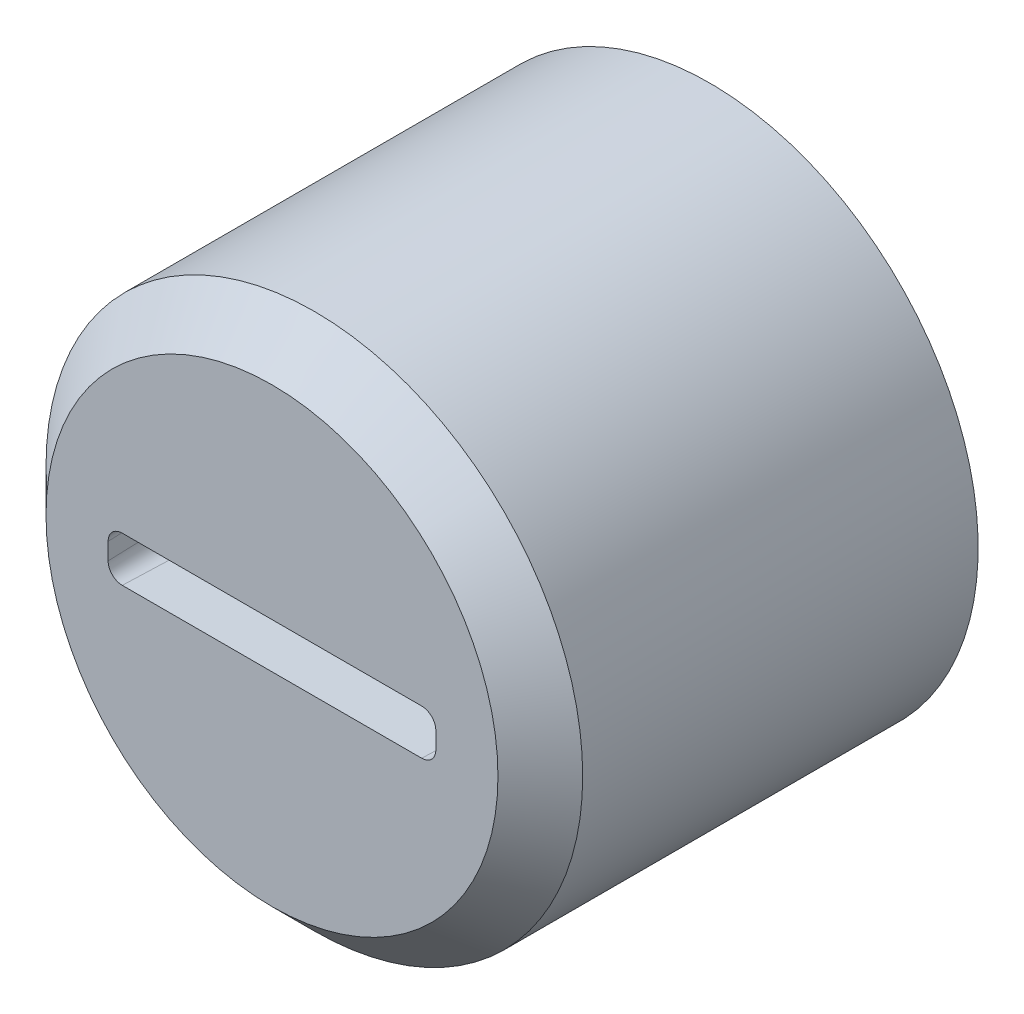
ISO-10303-21;
HEADER;
FILE_DESCRIPTION(('STEP AP214'),'2;1');
FILE_NAME('part.step','',(''),(''),'','','');
FILE_SCHEMA(('AUTOMOTIVE_DESIGN { 1 0 10303 214 1 1 1 1 }'));
ENDSEC;
DATA;
#1=APPLICATION_CONTEXT('core data for automotive mechanical design processes');
#2=APPLICATION_PROTOCOL_DEFINITION('international standard','automotive_design',2000,#1);
#3=PRODUCT_CONTEXT('',#1,'mechanical');
#4=PRODUCT('Part','Part','',(#3));
#5=PRODUCT_RELATED_PRODUCT_CATEGORY('part','',(#4));
#6=PRODUCT_DEFINITION_FORMATION('','',#4);
#7=PRODUCT_DEFINITION_CONTEXT('part definition',#1,'design');
#8=PRODUCT_DEFINITION('design','',#6,#7);
#9=PRODUCT_DEFINITION_SHAPE('','',#8);
#10=(LENGTH_UNIT() NAMED_UNIT(*) SI_UNIT(.MILLI.,.METRE.));
#11=(NAMED_UNIT(*) PLANE_ANGLE_UNIT() SI_UNIT($,.RADIAN.));
#12=(NAMED_UNIT(*) SI_UNIT($,.STERADIAN.) SOLID_ANGLE_UNIT());
#13=UNCERTAINTY_MEASURE_WITH_UNIT(LENGTH_MEASURE(1.E-05),#10,'distance_accuracy_value','');
#14=(GEOMETRIC_REPRESENTATION_CONTEXT(3) GLOBAL_UNCERTAINTY_ASSIGNED_CONTEXT((#13)) GLOBAL_UNIT_ASSIGNED_CONTEXT((#10,
#11,#12)) REPRESENTATION_CONTEXT('',''));
#15=CARTESIAN_POINT('',(0.,0.,0.));
#16=DIRECTION('',(0.,0.,1.));
#17=DIRECTION('',(1.,0.,0.));
#18=AXIS2_PLACEMENT_3D('',#15,#16,#17);
#19=CARTESIAN_POINT('',(2.9,0.,7.75));
#20=DIRECTION('',(-0.999390827019096,0.,-0.0348994967025009));
#21=DIRECTION('',(-0.0348994967025009,0.,0.999390827019096));
#22=AXIS2_PLACEMENT_3D('',#19,#20,#21);
#23=PLANE('',#22);
#24=DIRECTION('',(-0.034899496702501,0.,0.999390827019096));
#25=VECTOR('',#24,1.);
#26=CARTESIAN_POINT('',(17428.6346123457,-0.15,-499000.));
#27=LINE('',#26,#25);
#28=CARTESIAN_POINT('',(3.17063596356152,-0.15,4.26323473051715E-11));
#29=VERTEX_POINT('',#28);
#30=CARTESIAN_POINT('',(2.89999999999891,-0.15,7.75000000003308));
#31=VERTEX_POINT('',#30);
#32=EDGE_CURVE('E119',#29,#31,#27,.T.);
#33=ORIENTED_EDGE('',*,*,#32,.T.);
#34=DIRECTION('',(0.,1.,0.));
#35=VECTOR('',#34,1.);
#36=CARTESIAN_POINT('',(2.9,0.,7.75));
#37=LINE('',#36,#35);
#38=CARTESIAN_POINT('',(2.89999999999891,0.15,7.75000000003308));
#39=VERTEX_POINT('',#38);
#40=EDGE_CURVE('E106',#31,#39,#37,.T.);
#41=ORIENTED_EDGE('',*,*,#40,.T.);
#42=DIRECTION('',(-0.034899496702501,0.,0.999390827019096));
#43=VECTOR('',#42,1.);
#44=CARTESIAN_POINT('',(17428.6346123457,0.15,-499000.));
#45=LINE('',#44,#43);
#46=CARTESIAN_POINT('',(3.17063596356152,0.15,4.26323473051715E-11));
#47=VERTEX_POINT('',#46);
#48=EDGE_CURVE('E138',#39,#47,#45,.F.);
#49=ORIENTED_EDGE('',*,*,#48,.T.);
#50=DIRECTION('',(0.,1.,0.));
#51=VECTOR('',#50,1.);
#52=CARTESIAN_POINT('',(3.17063596356104,0.,0.));
#53=LINE('',#52,#51);
#54=EDGE_CURVE('E131',#47,#29,#53,.F.);
#55=ORIENTED_EDGE('',*,*,#54,.T.);
#56=EDGE_LOOP('',(#33,#41,#49,#55));
#57=FACE_BOUND('',#56,.T.);
#58=ADVANCED_FACE('F17',(#57),#23,.T.);
#59=CARTESIAN_POINT('',(-2.9,0.,7.75));
#60=DIRECTION('',(0.999390827019096,0.,-0.0348994967025009));
#61=DIRECTION('',(-0.0348994967025009,0.,-0.999390827019096));
#62=AXIS2_PLACEMENT_3D('',#59,#60,#61);
#63=PLANE('',#62);
#64=DIRECTION('',(0.,1.,0.));
#65=VECTOR('',#64,1.);
#66=CARTESIAN_POINT('',(-2.9,0.,7.75));
#67=LINE('',#66,#65);
#68=CARTESIAN_POINT('',(-2.89999999999742,0.15,7.75000000003308));
#69=VERTEX_POINT('',#68);
#70=CARTESIAN_POINT('',(-2.89999999999742,-0.15,7.75000000003308));
#71=VERTEX_POINT('',#70);
#72=EDGE_CURVE('E125',#69,#71,#67,.F.);
#73=ORIENTED_EDGE('',*,*,#72,.T.);
#74=DIRECTION('',(0.034899496702501,0.,0.999390827019096));
#75=VECTOR('',#74,1.);
#76=CARTESIAN_POINT('',(-17428.6346123457,-0.150000000002134,-499000.));
#77=LINE('',#76,#75);
#78=CARTESIAN_POINT('',(-3.17063596355899,-0.15,4.26323473051715E-11));
#79=VERTEX_POINT('',#78);
#80=EDGE_CURVE('E121',#71,#79,#77,.F.);
#81=ORIENTED_EDGE('',*,*,#80,.T.);
#82=DIRECTION('',(0.,1.,0.));
#83=VECTOR('',#82,1.);
#84=CARTESIAN_POINT('',(-3.17063596356104,0.,0.));
#85=LINE('',#84,#83);
#86=CARTESIAN_POINT('',(-3.17063596355899,0.15,4.26323473051715E-11));
#87=VERTEX_POINT('',#86);
#88=EDGE_CURVE('E127',#79,#87,#85,.T.);
#89=ORIENTED_EDGE('',*,*,#88,.T.);
#90=DIRECTION('',(0.034899496702501,0.,0.999390827019096));
#91=VECTOR('',#90,1.);
#92=CARTESIAN_POINT('',(-17428.6346123457,0.149999999997866,-499000.));
#93=LINE('',#92,#91);
#94=EDGE_CURVE('E134',#87,#69,#93,.T.);
#95=ORIENTED_EDGE('',*,*,#94,.T.);
#96=EDGE_LOOP('',(#73,#81,#89,#95));
#97=FACE_BOUND('',#96,.T.);
#98=ADVANCED_FACE('F182',(#97),#63,.T.);
#99=CARTESIAN_POINT('',(2.65,0.15,1.70530256582424E-10));
#100=DIRECTION('',(0.,0.,-1.));
#101=DIRECTION('',(-1.,0.,0.));
#102=AXIS2_PLACEMENT_3D('',#99,#100,#101);
#103=CONICAL_SURFACE('',#102,0.520635963556379,0.0349065850402135);
#104=CARTESIAN_POINT('',(2.65,0.15,0.));
#105=DIRECTION('',(0.,0.,-1.));
#106=DIRECTION('',(-1.,0.,0.));
#107=AXIS2_PLACEMENT_3D('',#104,#105,#106);
#108=CIRCLE('',#107,0.520635963562334);
#109=CARTESIAN_POINT('',(2.65,0.670635963561045,0.));
#110=VERTEX_POINT('',#109);
#111=EDGE_CURVE('E35',#47,#110,#108,.F.);
#112=ORIENTED_EDGE('',*,*,#111,.F.);
#113=ORIENTED_EDGE('',*,*,#48,.F.);
#114=CARTESIAN_POINT('',(2.65,0.15,7.74999999998727));
#115=DIRECTION('',(0.,0.,-1.));
#116=DIRECTION('',(-1.,0.,0.));
#117=AXIS2_PLACEMENT_3D('',#114,#115,#116);
#118=CIRCLE('',#117,0.249999999999196);
#119=CARTESIAN_POINT('',(2.65,0.400000000000222,7.74999999999363));
#120=VERTEX_POINT('',#119);
#121=EDGE_CURVE('E20',#120,#39,#118,.T.);
#122=ORIENTED_EDGE('',*,*,#121,.F.);
#123=DIRECTION('',(0.,0.0348994967025009,-0.999390827019096));
#124=VECTOR('',#123,1.);
#125=CARTESIAN_POINT('',(2.65,0.4,7.75));
#126=LINE('',#125,#124);
#127=EDGE_CURVE('E220',#110,#120,#126,.F.);
#128=ORIENTED_EDGE('',*,*,#127,.F.);
#129=EDGE_LOOP('',(#112,#113,#122,#128));
#130=FACE_BOUND('',#129,.T.);
#131=ADVANCED_FACE('F179',(#130),#103,.F.);
#132=CARTESIAN_POINT('',(-2.65,0.15,1.70530256582424E-10));
#133=DIRECTION('',(0.,0.,-1.));
#134=DIRECTION('',(-1.,0.,0.));
#135=AXIS2_PLACEMENT_3D('',#132,#133,#134);
#136=CONICAL_SURFACE('',#135,0.52063596355452,0.0349065850402135);
#137=CARTESIAN_POINT('',(-2.65,0.15,0.));
#138=DIRECTION('',(0.,0.,-1.));
#139=DIRECTION('',(-1.,0.,0.));
#140=AXIS2_PLACEMENT_3D('',#137,#138,#139);
#141=CIRCLE('',#140,0.520635963560475);
#142=CARTESIAN_POINT('',(-2.65,0.670635963561045,0.));
#143=VERTEX_POINT('',#142);
#144=EDGE_CURVE('E137',#143,#87,#141,.F.);
#145=ORIENTED_EDGE('',*,*,#144,.F.);
#146=DIRECTION('',(0.,0.0348994967025009,-0.999390827019096));
#147=VECTOR('',#146,1.);
#148=CARTESIAN_POINT('',(-2.65,0.4,7.75));
#149=LINE('',#148,#147);
#150=CARTESIAN_POINT('',(-2.65,0.400000000000222,7.74999999999363));
#151=VERTEX_POINT('',#150);
#152=EDGE_CURVE('E218',#151,#143,#149,.T.);
#153=ORIENTED_EDGE('',*,*,#152,.F.);
#154=CARTESIAN_POINT('',(-2.65,0.15,7.74999999998727));
#155=DIRECTION('',(0.,0.,-1.));
#156=DIRECTION('',(-1.,0.,0.));
#157=AXIS2_PLACEMENT_3D('',#154,#155,#156);
#158=CIRCLE('',#157,0.249999999997338);
#159=EDGE_CURVE('E60',#69,#151,#158,.T.);
#160=ORIENTED_EDGE('',*,*,#159,.F.);
#161=ORIENTED_EDGE('',*,*,#94,.F.);
#162=EDGE_LOOP('',(#145,#153,#160,#161));
#163=FACE_BOUND('',#162,.T.);
#164=ADVANCED_FACE('F176',(#163),#136,.F.);
#165=CARTESIAN_POINT('',(2.65,-0.15,1.70530256582424E-10));
#166=DIRECTION('',(0.,0.,-1.));
#167=DIRECTION('',(-1.,0.,0.));
#168=AXIS2_PLACEMENT_3D('',#165,#166,#167);
#169=CONICAL_SURFACE('',#168,0.520635963556379,0.0349065850402135);
#170=CARTESIAN_POINT('',(2.65,-0.15,0.));
#171=DIRECTION('',(0.,0.,-1.));
#172=DIRECTION('',(-1.,0.,0.));
#173=AXIS2_PLACEMENT_3D('',#170,#171,#172);
#174=CIRCLE('',#173,0.520635963562334);
#175=CARTESIAN_POINT('',(2.65,-0.670635963561045,0.));
#176=VERTEX_POINT('',#175);
#177=EDGE_CURVE('E93',#176,#29,#174,.F.);
#178=ORIENTED_EDGE('',*,*,#177,.F.);
#179=DIRECTION('',(0.,0.0348994967025009,0.999390827019096));
#180=VECTOR('',#179,1.);
#181=CARTESIAN_POINT('',(2.65,-0.4,7.75));
#182=LINE('',#181,#180);
#183=CARTESIAN_POINT('',(2.65,-0.400000000000222,7.74999999999363));
#184=VERTEX_POINT('',#183);
#185=EDGE_CURVE('E88',#184,#176,#182,.F.);
#186=ORIENTED_EDGE('',*,*,#185,.F.);
#187=CARTESIAN_POINT('',(2.65,-0.15,7.74999999998727));
#188=DIRECTION('',(0.,0.,-1.));
#189=DIRECTION('',(-1.,0.,0.));
#190=AXIS2_PLACEMENT_3D('',#187,#188,#189);
#191=CIRCLE('',#190,0.249999999999196);
#192=EDGE_CURVE('E92',#31,#184,#191,.T.);
#193=ORIENTED_EDGE('',*,*,#192,.F.);
#194=ORIENTED_EDGE('',*,*,#32,.F.);
#195=EDGE_LOOP('',(#178,#186,#193,#194));
#196=FACE_BOUND('',#195,.T.);
#197=ADVANCED_FACE('F90',(#196),#169,.F.);
#198=CARTESIAN_POINT('',(-2.65,-0.15,1.70530256582424E-10));
#199=DIRECTION('',(0.,0.,-1.));
#200=DIRECTION('',(-1.,0.,0.));
#201=AXIS2_PLACEMENT_3D('',#198,#199,#200);
#202=CONICAL_SURFACE('',#201,0.52063596355452,0.0349065850402135);
#203=CARTESIAN_POINT('',(-2.65,-0.15,0.));
#204=DIRECTION('',(0.,0.,-1.));
#205=DIRECTION('',(-1.,0.,0.));
#206=AXIS2_PLACEMENT_3D('',#203,#204,#205);
#207=CIRCLE('',#206,0.520635963560475);
#208=CARTESIAN_POINT('',(-2.65,-0.670635963561045,0.));
#209=VERTEX_POINT('',#208);
#210=EDGE_CURVE('E124',#79,#209,#207,.F.);
#211=ORIENTED_EDGE('',*,*,#210,.F.);
#212=ORIENTED_EDGE('',*,*,#80,.F.);
#213=CARTESIAN_POINT('',(-2.65,-0.15,7.74999999998727));
#214=DIRECTION('',(0.,0.,-1.));
#215=DIRECTION('',(-1.,0.,0.));
#216=AXIS2_PLACEMENT_3D('',#213,#214,#215);
#217=CIRCLE('',#216,0.249999999997338);
#218=CARTESIAN_POINT('',(-2.65,-0.400000000000222,7.74999999999363));
#219=VERTEX_POINT('',#218);
#220=EDGE_CURVE('E216',#219,#71,#217,.T.);
#221=ORIENTED_EDGE('',*,*,#220,.F.);
#222=DIRECTION('',(0.,0.0348994967025009,0.999390827019096));
#223=VECTOR('',#222,1.);
#224=CARTESIAN_POINT('',(-2.65,-0.4,7.75));
#225=LINE('',#224,#223);
#226=EDGE_CURVE('E98',#209,#219,#225,.T.);
#227=ORIENTED_EDGE('',*,*,#226,.F.);
#228=EDGE_LOOP('',(#211,#212,#221,#227));
#229=FACE_BOUND('',#228,.T.);
#230=ADVANCED_FACE('F169',(#229),#202,.F.);
#231=CARTESIAN_POINT('',(0.,0.4,7.75));
#232=DIRECTION('',(0.,-0.999390827019096,-0.0348994967025009));
#233=DIRECTION('',(0.,0.0348994967025009,-0.999390827019096));
#234=AXIS2_PLACEMENT_3D('',#231,#232,#233);
#235=PLANE('',#234);
#236=DIRECTION('',(1.,0.,0.));
#237=VECTOR('',#236,1.);
#238=CARTESIAN_POINT('',(0.,0.4,7.75));
#239=LINE('',#238,#237);
#240=EDGE_CURVE('E108',#151,#120,#239,.T.);
#241=ORIENTED_EDGE('',*,*,#240,.F.);
#242=ORIENTED_EDGE('',*,*,#152,.T.);
#243=DIRECTION('',(1.,0.,0.));
#244=VECTOR('',#243,1.);
#245=CARTESIAN_POINT('',(0.,0.670635963561045,0.));
#246=LINE('',#245,#244);
#247=EDGE_CURVE('E115',#143,#110,#246,.T.);
#248=ORIENTED_EDGE('',*,*,#247,.T.);
#249=ORIENTED_EDGE('',*,*,#127,.T.);
#250=EDGE_LOOP('',(#241,#242,#248,#249));
#251=FACE_BOUND('',#250,.T.);
#252=ADVANCED_FACE('F165',(#251),#235,.T.);
#253=CARTESIAN_POINT('',(0.,0.,7.75));
#254=DIRECTION('',(0.,0.,1.));
#255=DIRECTION('',(1.,0.,0.));
#256=AXIS2_PLACEMENT_3D('',#253,#254,#255);
#257=PLANE('',#256);
#258=CARTESIAN_POINT('',(0.,0.,7.74999999993042));
#259=DIRECTION('',(0.,0.,-1.));
#260=DIRECTION('',(0.,1.,0.));
#261=AXIS2_PLACEMENT_3D('',#258,#259,#260);
#262=CIRCLE('',#261,4.0000000000191);
#263=CARTESIAN_POINT('',(0.,4.0000000000191,7.74999999993042));
#264=VERTEX_POINT('',#263);
#265=EDGE_CURVE('E206',#264,#264,#262,.T.);
#266=ORIENTED_EDGE('',*,*,#265,.F.);
#267=EDGE_LOOP('',(#266));
#268=FACE_BOUND('',#267,.T.);
#269=ORIENTED_EDGE('',*,*,#40,.F.);
#270=ORIENTED_EDGE('',*,*,#192,.T.);
#271=DIRECTION('',(1.,0.,0.));
#272=VECTOR('',#271,1.);
#273=CARTESIAN_POINT('',(0.,-0.4,7.75));
#274=LINE('',#273,#272);
#275=EDGE_CURVE('E103',#219,#184,#274,.T.);
#276=ORIENTED_EDGE('',*,*,#275,.F.);
#277=ORIENTED_EDGE('',*,*,#220,.T.);
#278=ORIENTED_EDGE('',*,*,#72,.F.);
#279=ORIENTED_EDGE('',*,*,#159,.T.);
#280=ORIENTED_EDGE('',*,*,#240,.T.);
#281=ORIENTED_EDGE('',*,*,#121,.T.);
#282=EDGE_LOOP('',(#269,#270,#276,#277,#278,#279,#280,#281));
#283=FACE_BOUND('',#282,.T.);
#284=ADVANCED_FACE('F101',(#268,#283),#257,.T.);
#285=CARTESIAN_POINT('',(0.,-0.4,7.75));
#286=DIRECTION('',(0.,0.999390827019096,-0.0348994967025009));
#287=DIRECTION('',(0.,0.0348994967025009,0.999390827019096));
#288=AXIS2_PLACEMENT_3D('',#285,#286,#287);
#289=PLANE('',#288);
#290=ORIENTED_EDGE('',*,*,#226,.T.);
#291=ORIENTED_EDGE('',*,*,#275,.T.);
#292=ORIENTED_EDGE('',*,*,#185,.T.);
#293=DIRECTION('',(1.,0.,0.));
#294=VECTOR('',#293,1.);
#295=CARTESIAN_POINT('',(0.,-0.670635963561045,0.));
#296=LINE('',#295,#294);
#297=EDGE_CURVE('E113',#176,#209,#296,.F.);
#298=ORIENTED_EDGE('',*,*,#297,.T.);
#299=EDGE_LOOP('',(#290,#291,#292,#298));
#300=FACE_BOUND('',#299,.T.);
#301=CARTESIAN_POINT('',(0.,-0.635715194069297,1.));
#302=DIRECTION('',(0.,0.999390827019096,-0.0348994967025009));
#303=DIRECTION('',(0.,0.0348994967025009,0.999390827019096));
#304=AXIS2_PLACEMENT_3D('',#301,#302,#303);
#305=ELLIPSE('',#304,0.500304772149411,0.5);
#306=CARTESIAN_POINT('',(0.,-0.618254809323424,1.5));
#307=VERTEX_POINT('',#306);
#308=EDGE_CURVE('E203',#307,#307,#305,.F.);
#309=ORIENTED_EDGE('',*,*,#308,.T.);
#310=EDGE_LOOP('',(#309));
#311=FACE_BOUND('',#310,.T.);
#312=ADVANCED_FACE('F110',(#300,#311),#289,.T.);
#313=CARTESIAN_POINT('',(0.,0.,0.));
#314=DIRECTION('',(0.,0.,1.));
#315=DIRECTION('',(1.,0.,0.));
#316=AXIS2_PLACEMENT_3D('',#313,#314,#315);
#317=PLANE('',#316);
#318=ORIENTED_EDGE('',*,*,#111,.T.);
#319=ORIENTED_EDGE('',*,*,#247,.F.);
#320=ORIENTED_EDGE('',*,*,#144,.T.);
#321=ORIENTED_EDGE('',*,*,#88,.F.);
#322=ORIENTED_EDGE('',*,*,#210,.T.);
#323=ORIENTED_EDGE('',*,*,#297,.F.);
#324=ORIENTED_EDGE('',*,*,#177,.T.);
#325=ORIENTED_EDGE('',*,*,#54,.F.);
#326=EDGE_LOOP('',(#318,#319,#320,#321,#322,#323,#324,#325));
#327=FACE_BOUND('',#326,.T.);
#328=CARTESIAN_POINT('',(0.,0.,0.));
#329=DIRECTION('',(0.,0.,-1.));
#330=DIRECTION('',(-1.,0.,0.));
#331=AXIS2_PLACEMENT_3D('',#328,#329,#330);
#332=CIRCLE('',#331,4.75);
#333=CARTESIAN_POINT('',(-4.75,0.,0.));
#334=VERTEX_POINT('',#333);
#335=EDGE_CURVE('E201',#334,#334,#332,.F.);
#336=ORIENTED_EDGE('',*,*,#335,.F.);
#337=EDGE_LOOP('',(#336));
#338=FACE_BOUND('',#337,.T.);
#339=ADVANCED_FACE('F157',(#327,#338),#317,.F.);
#340=CARTESIAN_POINT('',(0.,0.,6.99999999994816));
#341=DIRECTION('',(0.,0.,-1.));
#342=DIRECTION('',(0.,1.,0.));
#343=AXIS2_PLACEMENT_3D('',#340,#341,#342);
#344=CONICAL_SURFACE('',#343,4.75000000000136,0.785398163397448);
#345=ORIENTED_EDGE('',*,*,#265,.T.);
#346=EDGE_LOOP('',(#345));
#347=FACE_BOUND('',#346,.T.);
#348=CARTESIAN_POINT('',(0.,0.,7.));
#349=DIRECTION('',(0.,0.,-1.));
#350=DIRECTION('',(-1.,0.,0.));
#351=AXIS2_PLACEMENT_3D('',#348,#349,#350);
#352=CIRCLE('',#351,4.75);
#353=CARTESIAN_POINT('',(-4.75,0.,7.));
#354=VERTEX_POINT('',#353);
#355=EDGE_CURVE('E26',#354,#354,#352,.T.);
#356=ORIENTED_EDGE('',*,*,#355,.F.);
#357=EDGE_LOOP('',(#356));
#358=FACE_BOUND('',#357,.T.);
#359=ADVANCED_FACE('F153',(#347,#358),#344,.T.);
#360=CARTESIAN_POINT('',(0.,-18.6752250187347,1.));
#361=DIRECTION('',(0.,1.,0.));
#362=DIRECTION('',(0.,0.,1.));
#363=AXIS2_PLACEMENT_3D('',#360,#361,#362);
#364=CYLINDRICAL_SURFACE('',#363,0.5);
#365=ORIENTED_EDGE('',*,*,#308,.F.);
#366=EDGE_LOOP('',(#365));
#367=FACE_BOUND('',#366,.T.);
#368=CARTESIAN_POINT('',(0.353703701662646,-4.73681260885737,1.35340301559288));
#369=CARTESIAN_POINT('',(0.33386771866279,-4.738293654982,1.37325424900279));
#370=CARTESIAN_POINT('',(0.312343904992819,-4.73977510886786,1.39144484504057));
#371=CARTESIAN_POINT('',(0.266525877372656,-4.74257216259314,1.42397515568803));
#372=CARTESIAN_POINT('',(0.242228704070014,-4.74388758205229,1.43831070094542));
#373=CARTESIAN_POINT('',(0.19156372030538,-4.74620325697714,1.46270213623952));
#374=CARTESIAN_POINT('',(0.165196412548895,-4.74720358866395,1.47275906149976));
#375=CARTESIAN_POINT('',(0.111142027992247,-4.74877645905065,1.48830132489252));
#376=CARTESIAN_POINT('',(0.08345528436208,-4.74934910514268,1.49378781070528));
#377=CARTESIAN_POINT('',(0.0276449126213891,-4.7500012282734,1.5000214043672));
#378=CARTESIAN_POINT('',(-0.000476864691599227,-4.75008241082947,1.50078490252016));
#379=CARTESIAN_POINT('',(-0.0564490055383753,-4.74974703212947,1.49759350534887));
#380=CARTESIAN_POINT('',(-0.0842993628890795,-4.74933045956089,1.49363850278692));
#381=CARTESIAN_POINT('',(-0.138871181630196,-4.74804785815969,1.48114091437481));
#382=CARTESIAN_POINT('',(-0.165595115653065,-4.74718287588632,1.47260900911268));
#383=CARTESIAN_POINT('',(-0.217232441648643,-4.74510046699513,1.45121081172507));
#384=CARTESIAN_POINT('',(-0.242145792891575,-4.74388303245184,1.43834442213032));
#385=CARTESIAN_POINT('',(-0.289556171642596,-4.74122598297849,1.40858711678774));
#386=CARTESIAN_POINT('',(-0.31204391569974,-4.73978556248463,1.39168148342839));
#387=CARTESIAN_POINT('',(-0.353870560799868,-4.73684664049122,1.35434660584866));
#388=CARTESIAN_POINT('',(-0.373209380017486,-4.73534813748365,1.33391727009264));
#389=CARTESIAN_POINT('',(-0.408267881738243,-4.7324548442842,1.29001646167723));
#390=CARTESIAN_POINT('',(-0.423972757420466,-4.73106049355898,1.26653313143396));
#391=CARTESIAN_POINT('',(-0.451215656660102,-4.72854019784085,1.21724909215438));
#392=CARTESIAN_POINT('',(-0.462753734043463,-4.72741424938084,1.19144841305853));
#393=CARTESIAN_POINT('',(-0.481310945150463,-4.72556104305759,1.13831193101837));
#394=CARTESIAN_POINT('',(-0.488338741318539,-4.72483302133791,1.11097918107221));
#395=CARTESIAN_POINT('',(-0.497703938060725,-4.72385576790122,1.05551356485525));
#396=CARTESIAN_POINT('',(-0.50004149918846,-4.72360651979511,1.02738072600611));
#397=CARTESIAN_POINT('',(-0.499957586980414,-4.72361539080803,0.97126049637626));
#398=CARTESIAN_POINT('',(-0.497559348168848,-4.7238710328633,0.943273067583411));
#399=CARTESIAN_POINT('',(-0.488120797012175,-4.72485558254728,0.88810115919084));
#400=CARTESIAN_POINT('',(-0.481080486368467,-4.72558449000252,0.860916679296828));
#401=CARTESIAN_POINT('',(-0.462564467038008,-4.72743271098494,0.808123803650344));
#402=CARTESIAN_POINT('',(-0.451089649668127,-4.72855194605354,0.78251509237342));
#403=CARTESIAN_POINT('',(-0.424032301964688,-4.73105489411378,0.733582469345806));
#404=CARTESIAN_POINT('',(-0.408449639771491,-4.7324386155949,0.710258630971294));
#405=CARTESIAN_POINT('',(-0.373530265403456,-4.7353228635635,0.666437714488955));
#406=CARTESIAN_POINT('',(-0.354175881476658,-4.73682391915963,0.645954751806844));
#407=CARTESIAN_POINT('',(-0.312303845225488,-4.73976854724432,0.608522093693151));
#408=CARTESIAN_POINT('',(-0.289786142638981,-4.74121211881903,0.59157245441336));
#409=CARTESIAN_POINT('',(-0.242161387068987,-4.74388312712586,0.561650225556347));
#410=CARTESIAN_POINT('',(-0.217048425847268,-4.74511005266915,0.548686990111902));
#411=CARTESIAN_POINT('',(-0.164987064342186,-4.7472052014959,0.527165357054135));
#412=CARTESIAN_POINT('',(-0.138038712510549,-4.74807343424407,0.518606843213366));
#413=CARTESIAN_POINT('',(-0.083178331488751,-4.74935058665899,0.506168551615137));
#414=CARTESIAN_POINT('',(-0.0552702775618727,-4.74976120974526,0.502271418200207));
#415=CARTESIAN_POINT('',(0.000806641622450197,-4.75008266857047,0.499212827110672));
#416=CARTESIAN_POINT('',(0.0289755000226912,-4.74999351741268,0.500051245277561));
#417=CARTESIAN_POINT('',(0.084657021572058,-4.74932686142737,0.506425900424692));
#418=CARTESIAN_POINT('',(0.112171838060965,-4.74875128797264,0.511943558465832));
#419=CARTESIAN_POINT('',(0.165882675099623,-4.74717866584529,0.527491145621454));
#420=CARTESIAN_POINT('',(0.192078679394129,-4.74618161197906,0.537521130338261));
#421=CARTESIAN_POINT('',(0.242467107769172,-4.74387476109425,0.561829125361394));
#422=CARTESIAN_POINT('',(0.266655524848553,-4.74256435795775,0.576115381996967));
#423=CARTESIAN_POINT('',(0.312298467562805,-4.73977777228996,0.60852440639424));
#424=CARTESIAN_POINT('',(0.333752898818331,-4.73830158403894,0.626647306542456));
#425=CARTESIAN_POINT('',(0.373427734666188,-4.73534056508444,0.666319759496527));
#426=CARTESIAN_POINT('',(0.391631967858778,-4.73385572715858,0.68788548799576));
#427=CARTESIAN_POINT('',(0.424164476807286,-4.73105188789521,0.733775371991894));
#428=CARTESIAN_POINT('',(0.438492740321634,-4.72973288708147,0.758099536200485));
#429=CARTESIAN_POINT('',(0.462866691573307,-4.72740997823088,0.808828674638043));
#430=CARTESIAN_POINT('',(0.472911304702166,-4.72640614927556,0.835234169029211));
#431=CARTESIAN_POINT('',(0.488419323609566,-4.72482887186484,0.889368984435579));
#432=CARTESIAN_POINT('',(0.493883042781077,-4.72425539396809,0.917098214752752));
#433=CARTESIAN_POINT('',(0.500053798452956,-4.72360624526351,0.972949186304378));
#434=CARTESIAN_POINT('',(0.500783940583428,-4.72352815639314,1.00106834846813));
#435=CARTESIAN_POINT('',(0.497526608579003,-4.72387233515647,1.0570354157117));
#436=CARTESIAN_POINT('',(0.493538164521574,-4.72429470566143,1.08488326383543));
#437=CARTESIAN_POINT('',(0.480973462250818,-4.7255903249112,1.13945373883012));
#438=CARTESIAN_POINT('',(0.472405969059184,-4.72646271214227,1.16617841056951));
#439=CARTESIAN_POINT('',(0.450940312328492,-4.72855879243608,1.21778987848336));
#440=CARTESIAN_POINT('',(0.438046675576878,-4.72978211809085,1.24267856272655));
#441=CARTESIAN_POINT('',(0.413268514583604,-4.73199825642417,1.28205759147161));
#442=CARTESIAN_POINT('',(0.402477304541763,-4.73293220846762,1.29725103909799));
#443=CARTESIAN_POINT('',(0.379272777494176,-4.73484825000772,1.32634082200737));
#444=CARTESIAN_POINT('',(0.366859452153781,-4.73583033975169,1.34023715062496));
#445=CARTESIAN_POINT('',(0.353703701662646,-4.73681260885737,1.35340301559288));
#446=B_SPLINE_CURVE_WITH_KNOTS('',3,(#368,#369,#370,#371,#372,#373,#374,#375,#376,#377,#378,
#379,#380,#381,#382,#383,#384,#385,#386,#387,#388,#389,#390,#391,#392,#393,#394,#395,#396,#397,
#398,#399,#400,#401,#402,#403,#404,#405,#406,#407,#408,#409,#410,#411,#412,#413,#414,#415,#416,
#417,#418,#419,#420,#421,#422,#423,#424,#425,#426,#427,#428,#429,#430,#431,#432,#433,#434,#435,
#436,#437,#438,#439,#440,#441,#442,#443,#444,#445),.UNSPECIFIED.,.T.,.F.,(4,2,2,2,2,2,2,2,2,2,2,
2,2,2,2,2,2,2,2,2,2,2,2,2,2,2,2,2,2,2,2,2,2,2,2,2,2,2,4),(0.,0.084238973353797,
0.168568690557419,0.252877992340925,0.337166116880344,0.421161569351068,0.505158930828701,
0.588961124681703,0.672765203115166,0.756879420742862,0.840995823744594,0.92544915714279,
1.00990139954906,1.09419095373363,1.1784776225139,1.2623517959493,1.34622593864338,
1.4300832317545,1.51394321696809,1.59820599386724,1.6824701097735,1.76693046943243,
1.85138860032044,1.93553128061316,2.01967175483108,2.1034797047416,2.18728868738863,
2.27126111384731,2.35523643831554,2.43961859684946,2.5240010218865,2.60840460289932,
2.69280240913371,2.77678793895349,2.86079073530394,2.94463330993423,3.02838842561239,
3.08425766187182,3.14012718520626),.UNSPECIFIED.);
#447=CARTESIAN_POINT('',(0.353703701662646,-4.73681260885737,1.35340301559288));
#448=VERTEX_POINT('',#447);
#449=EDGE_CURVE('E11',#448,#448,#446,.F.);
#450=ORIENTED_EDGE('',*,*,#449,.F.);
#451=EDGE_LOOP('',(#450));
#452=FACE_BOUND('',#451,.T.);
#453=ADVANCED_FACE('F149',(#367,#452),#364,.F.);
#454=CARTESIAN_POINT('',(0.,0.,7.75));
#455=DIRECTION('',(0.,0.,-1.));
#456=DIRECTION('',(-1.,0.,0.));
#457=AXIS2_PLACEMENT_3D('',#454,#455,#456);
#458=CYLINDRICAL_SURFACE('',#457,4.75);
#459=ORIENTED_EDGE('',*,*,#449,.T.);
#460=EDGE_LOOP('',(#459));
#461=FACE_BOUND('',#460,.T.);
#462=ORIENTED_EDGE('',*,*,#355,.T.);
#463=EDGE_LOOP('',(#462));
#464=FACE_BOUND('',#463,.T.);
#465=ORIENTED_EDGE('',*,*,#335,.T.);
#466=EDGE_LOOP('',(#465));
#467=FACE_BOUND('',#466,.T.);
#468=ADVANCED_FACE('F147',(#461,#464,#467),#458,.T.);
#469=CLOSED_SHELL('',(#58,#98,#131,#164,#197,#230,#252,#284,#312,#339,#359,#453,#468));
#470=MANIFOLD_SOLID_BREP('B1',#469);
#471=ADVANCED_BREP_SHAPE_REPRESENTATION('',(#18,#470),#14);
#472=SHAPE_DEFINITION_REPRESENTATION(#9,#471);
ENDSEC;
END-ISO-10303-21;
